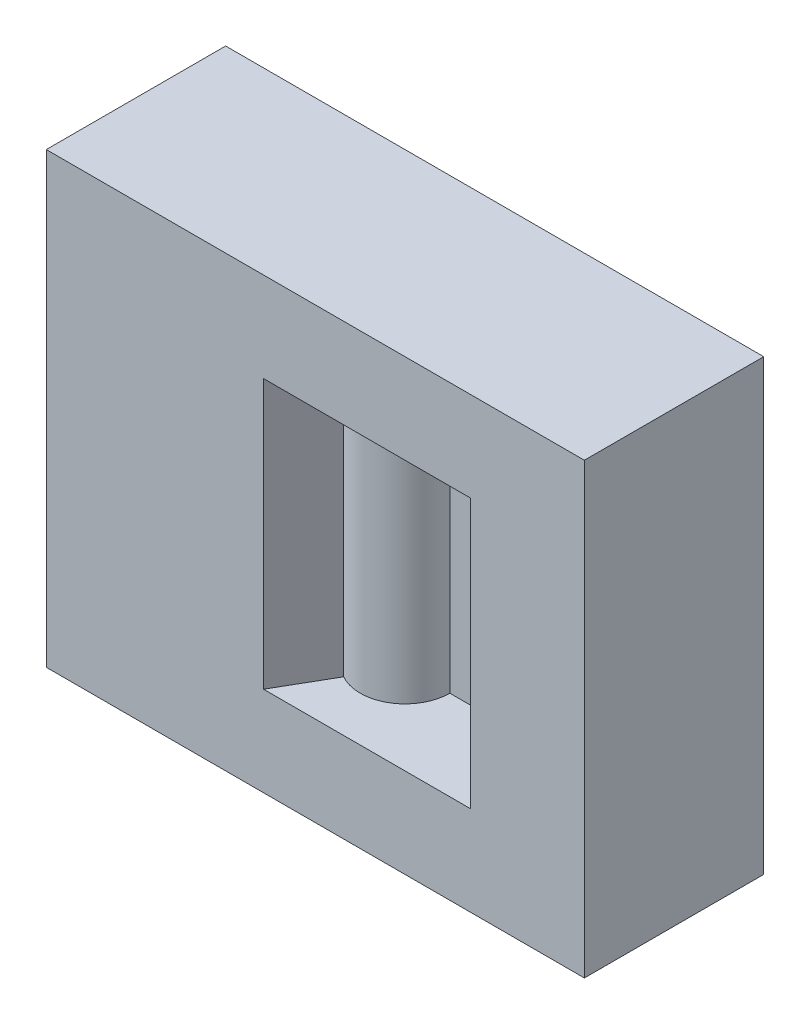
ISO-10303-21;
HEADER;
FILE_DESCRIPTION(('STEP AP214'),'2;1');
FILE_NAME('part.step','',(''),(''),'','','');
FILE_SCHEMA(('AUTOMOTIVE_DESIGN { 1 0 10303 214 1 1 1 1 }'));
ENDSEC;
DATA;
#1=APPLICATION_CONTEXT('core data for automotive mechanical design processes');
#2=APPLICATION_PROTOCOL_DEFINITION('international standard','automotive_design',2000,#1);
#3=PRODUCT_CONTEXT('',#1,'mechanical');
#4=PRODUCT('Part','Part','',(#3));
#5=PRODUCT_RELATED_PRODUCT_CATEGORY('part','',(#4));
#6=PRODUCT_DEFINITION_FORMATION('','',#4);
#7=PRODUCT_DEFINITION_CONTEXT('part definition',#1,'design');
#8=PRODUCT_DEFINITION('design','',#6,#7);
#9=PRODUCT_DEFINITION_SHAPE('','',#8);
#10=(LENGTH_UNIT() NAMED_UNIT(*) SI_UNIT(.MILLI.,.METRE.));
#11=(NAMED_UNIT(*) PLANE_ANGLE_UNIT() SI_UNIT($,.RADIAN.));
#12=(NAMED_UNIT(*) SI_UNIT($,.STERADIAN.) SOLID_ANGLE_UNIT());
#13=UNCERTAINTY_MEASURE_WITH_UNIT(LENGTH_MEASURE(1.E-05),#10,'distance_accuracy_value','');
#14=(GEOMETRIC_REPRESENTATION_CONTEXT(3) GLOBAL_UNCERTAINTY_ASSIGNED_CONTEXT((#13)) GLOBAL_UNIT_ASSIGNED_CONTEXT((#10,
#11,#12)) REPRESENTATION_CONTEXT('',''));
#15=CARTESIAN_POINT('',(0.,0.,0.));
#16=DIRECTION('',(0.,0.,1.));
#17=DIRECTION('',(1.,0.,0.));
#18=AXIS2_PLACEMENT_3D('',#15,#16,#17);
#19=CARTESIAN_POINT('',(0.,0.,10.));
#20=DIRECTION('',(0.,0.,1.));
#21=DIRECTION('',(1.,0.,0.));
#22=AXIS2_PLACEMENT_3D('',#19,#20,#21);
#23=PLANE('',#22);
#24=DIRECTION('',(0.,-1.,0.));
#25=VECTOR('',#24,1.);
#26=CARTESIAN_POINT('',(-30.,40.,10.));
#27=LINE('',#26,#25);
#28=CARTESIAN_POINT('',(-30.,40.,10.));
#29=VERTEX_POINT('',#28);
#30=CARTESIAN_POINT('',(-30.,-10.,10.));
#31=VERTEX_POINT('',#30);
#32=EDGE_CURVE('E161',#29,#31,#27,.T.);
#33=ORIENTED_EDGE('',*,*,#32,.T.);
#34=DIRECTION('',(1.,0.,0.));
#35=VECTOR('',#34,1.);
#36=CARTESIAN_POINT('',(-30.,-10.,10.));
#37=LINE('',#36,#35);
#38=CARTESIAN_POINT('',(30.,-10.,10.));
#39=VERTEX_POINT('',#38);
#40=EDGE_CURVE('E94',#31,#39,#37,.T.);
#41=ORIENTED_EDGE('',*,*,#40,.T.);
#42=DIRECTION('',(0.,1.,0.));
#43=VECTOR('',#42,1.);
#44=CARTESIAN_POINT('',(30.,-10.,10.));
#45=LINE('',#44,#43);
#46=CARTESIAN_POINT('',(30.,40.,10.));
#47=VERTEX_POINT('',#46);
#48=EDGE_CURVE('E164',#39,#47,#45,.T.);
#49=ORIENTED_EDGE('',*,*,#48,.T.);
#50=DIRECTION('',(-1.,0.,0.));
#51=VECTOR('',#50,1.);
#52=CARTESIAN_POINT('',(30.,40.,10.));
#53=LINE('',#52,#51);
#54=EDGE_CURVE('E65',#47,#29,#53,.T.);
#55=ORIENTED_EDGE('',*,*,#54,.T.);
#56=EDGE_LOOP('',(#33,#41,#49,#55));
#57=FACE_BOUND('',#56,.T.);
#58=DIRECTION('',(0.,1.,0.));
#59=VECTOR('',#58,1.);
#60=CARTESIAN_POINT('',(17.3205080756888,0.,10.));
#61=LINE('',#60,#59);
#62=CARTESIAN_POINT('',(17.3205080756888,30.,10.));
#63=VERTEX_POINT('',#62);
#64=CARTESIAN_POINT('',(17.3205080756888,0.,10.));
#65=VERTEX_POINT('',#64);
#66=EDGE_CURVE('E49',#63,#65,#61,.F.);
#67=ORIENTED_EDGE('',*,*,#66,.T.);
#68=DIRECTION('',(-1.,0.,0.));
#69=VECTOR('',#68,1.);
#70=CARTESIAN_POINT('',(0.,0.,10.));
#71=LINE('',#70,#69);
#72=CARTESIAN_POINT('',(-5.77350269189625,0.,10.));
#73=VERTEX_POINT('',#72);
#74=EDGE_CURVE('E11',#65,#73,#71,.T.);
#75=ORIENTED_EDGE('',*,*,#74,.T.);
#76=DIRECTION('',(0.,-1.,0.));
#77=VECTOR('',#76,1.);
#78=CARTESIAN_POINT('',(-5.77350269189625,0.,10.));
#79=LINE('',#78,#77);
#80=CARTESIAN_POINT('',(-5.77350269189625,30.,10.));
#81=VERTEX_POINT('',#80);
#82=EDGE_CURVE('E183',#81,#73,#79,.T.);
#83=ORIENTED_EDGE('',*,*,#82,.F.);
#84=DIRECTION('',(1.,0.,0.));
#85=VECTOR('',#84,1.);
#86=CARTESIAN_POINT('',(0.,30.,10.));
#87=LINE('',#86,#85);
#88=EDGE_CURVE('E185',#81,#63,#87,.T.);
#89=ORIENTED_EDGE('',*,*,#88,.T.);
#90=EDGE_LOOP('',(#67,#75,#83,#89));
#91=FACE_BOUND('',#90,.T.);
#92=ADVANCED_FACE('F41',(#57,#91),#23,.T.);
#93=CARTESIAN_POINT('',(-30.,40.,10.));
#94=DIRECTION('',(1.,0.,0.));
#95=DIRECTION('',(0.,0.,-1.));
#96=AXIS2_PLACEMENT_3D('',#93,#94,#95);
#97=PLANE('',#96);
#98=DIRECTION('',(0.,-1.,0.));
#99=VECTOR('',#98,1.);
#100=CARTESIAN_POINT('',(-30.,40.,-10.));
#101=LINE('',#100,#99);
#102=CARTESIAN_POINT('',(-30.,40.,-10.));
#103=VERTEX_POINT('',#102);
#104=CARTESIAN_POINT('',(-30.,-10.,-10.));
#105=VERTEX_POINT('',#104);
#106=EDGE_CURVE('E133',#103,#105,#101,.T.);
#107=ORIENTED_EDGE('',*,*,#106,.T.);
#108=DIRECTION('',(0.,0.,-1.));
#109=VECTOR('',#108,1.);
#110=CARTESIAN_POINT('',(-30.,-10.,10.));
#111=LINE('',#110,#109);
#112=EDGE_CURVE('E181',#31,#105,#111,.T.);
#113=ORIENTED_EDGE('',*,*,#112,.F.);
#114=ORIENTED_EDGE('',*,*,#32,.F.);
#115=DIRECTION('',(0.,0.,-1.));
#116=VECTOR('',#115,1.);
#117=CARTESIAN_POINT('',(-30.,40.,10.));
#118=LINE('',#117,#116);
#119=EDGE_CURVE('E167',#29,#103,#118,.T.);
#120=ORIENTED_EDGE('',*,*,#119,.T.);
#121=EDGE_LOOP('',(#107,#113,#114,#120));
#122=FACE_BOUND('',#121,.T.);
#123=ADVANCED_FACE('F43',(#122),#97,.F.);
#124=CARTESIAN_POINT('',(-30.,-10.,10.));
#125=DIRECTION('',(0.,1.,0.));
#126=DIRECTION('',(0.,0.,1.));
#127=AXIS2_PLACEMENT_3D('',#124,#125,#126);
#128=PLANE('',#127);
#129=DIRECTION('',(1.,0.,0.));
#130=VECTOR('',#129,1.);
#131=CARTESIAN_POINT('',(-30.,-10.,-10.));
#132=LINE('',#131,#130);
#133=CARTESIAN_POINT('',(30.,-10.,-10.));
#134=VERTEX_POINT('',#133);
#135=EDGE_CURVE('E170',#105,#134,#132,.T.);
#136=ORIENTED_EDGE('',*,*,#135,.T.);
#137=DIRECTION('',(0.,0.,-1.));
#138=VECTOR('',#137,1.);
#139=CARTESIAN_POINT('',(30.,-10.,10.));
#140=LINE('',#139,#138);
#141=EDGE_CURVE('E178',#39,#134,#140,.T.);
#142=ORIENTED_EDGE('',*,*,#141,.F.);
#143=ORIENTED_EDGE('',*,*,#40,.F.);
#144=ORIENTED_EDGE('',*,*,#112,.T.);
#145=EDGE_LOOP('',(#136,#142,#143,#144));
#146=FACE_BOUND('',#145,.T.);
#147=ADVANCED_FACE('F212',(#146),#128,.F.);
#148=CARTESIAN_POINT('',(30.,-10.,10.));
#149=DIRECTION('',(-1.,0.,0.));
#150=DIRECTION('',(0.,0.,1.));
#151=AXIS2_PLACEMENT_3D('',#148,#149,#150);
#152=PLANE('',#151);
#153=DIRECTION('',(0.,1.,0.));
#154=VECTOR('',#153,1.);
#155=CARTESIAN_POINT('',(30.,-10.,-10.));
#156=LINE('',#155,#154);
#157=CARTESIAN_POINT('',(30.,40.,-10.));
#158=VERTEX_POINT('',#157);
#159=EDGE_CURVE('E172',#134,#158,#156,.T.);
#160=ORIENTED_EDGE('',*,*,#159,.T.);
#161=DIRECTION('',(0.,0.,-1.));
#162=VECTOR('',#161,1.);
#163=CARTESIAN_POINT('',(30.,40.,10.));
#164=LINE('',#163,#162);
#165=EDGE_CURVE('E176',#47,#158,#164,.T.);
#166=ORIENTED_EDGE('',*,*,#165,.F.);
#167=ORIENTED_EDGE('',*,*,#48,.F.);
#168=ORIENTED_EDGE('',*,*,#141,.T.);
#169=EDGE_LOOP('',(#160,#166,#167,#168));
#170=FACE_BOUND('',#169,.T.);
#171=ADVANCED_FACE('F223',(#170),#152,.F.);
#172=CARTESIAN_POINT('',(30.,40.,10.));
#173=DIRECTION('',(0.,-1.,0.));
#174=DIRECTION('',(0.,0.,-1.));
#175=AXIS2_PLACEMENT_3D('',#172,#173,#174);
#176=PLANE('',#175);
#177=DIRECTION('',(-1.,0.,0.));
#178=VECTOR('',#177,1.);
#179=CARTESIAN_POINT('',(30.,40.,-10.));
#180=LINE('',#179,#178);
#181=EDGE_CURVE('E86',#158,#103,#180,.T.);
#182=ORIENTED_EDGE('',*,*,#181,.T.);
#183=ORIENTED_EDGE('',*,*,#119,.F.);
#184=ORIENTED_EDGE('',*,*,#54,.F.);
#185=ORIENTED_EDGE('',*,*,#165,.T.);
#186=EDGE_LOOP('',(#182,#183,#184,#185));
#187=FACE_BOUND('',#186,.T.);
#188=ADVANCED_FACE('F219',(#187),#176,.F.);
#189=CARTESIAN_POINT('',(0.,0.,-10.));
#190=DIRECTION('',(0.,0.,1.));
#191=DIRECTION('',(1.,0.,0.));
#192=AXIS2_PLACEMENT_3D('',#189,#190,#191);
#193=PLANE('',#192);
#194=ORIENTED_EDGE('',*,*,#106,.F.);
#195=ORIENTED_EDGE('',*,*,#181,.F.);
#196=ORIENTED_EDGE('',*,*,#159,.F.);
#197=ORIENTED_EDGE('',*,*,#135,.F.);
#198=EDGE_LOOP('',(#194,#195,#196,#197));
#199=FACE_BOUND('',#198,.T.);
#200=ADVANCED_FACE('F217',(#199),#193,.F.);
#201=CARTESIAN_POINT('',(0.,0.,0.));
#202=DIRECTION('',(0.,1.,0.));
#203=DIRECTION('',(0.,0.,1.));
#204=AXIS2_PLACEMENT_3D('',#201,#202,#203);
#205=CYLINDRICAL_SURFACE('',#204,5.);
#206=CARTESIAN_POINT('',(0.,0.,0.));
#207=DIRECTION('',(0.,1.,0.));
#208=DIRECTION('',(0.,0.,1.));
#209=AXIS2_PLACEMENT_3D('',#206,#207,#208);
#210=CIRCLE('',#209,5.);
#211=CARTESIAN_POINT('',(-2.5,0.,4.33012701892219));
#212=VERTEX_POINT('',#211);
#213=CARTESIAN_POINT('',(5.,0.,0.));
#214=VERTEX_POINT('',#213);
#215=EDGE_CURVE('E122',#212,#214,#210,.T.);
#216=ORIENTED_EDGE('',*,*,#215,.T.);
#217=DIRECTION('',(0.,-1.,0.));
#218=VECTOR('',#217,1.);
#219=CARTESIAN_POINT('',(5.,30.,0.));
#220=LINE('',#219,#218);
#221=CARTESIAN_POINT('',(5.,30.,0.));
#222=VERTEX_POINT('',#221);
#223=EDGE_CURVE('E126',#222,#214,#220,.T.);
#224=ORIENTED_EDGE('',*,*,#223,.F.);
#225=CARTESIAN_POINT('',(0.,30.,0.));
#226=DIRECTION('',(0.,1.,0.));
#227=DIRECTION('',(0.,0.,1.));
#228=AXIS2_PLACEMENT_3D('',#225,#226,#227);
#229=CIRCLE('',#228,5.);
#230=CARTESIAN_POINT('',(-2.5,30.,4.33012701892219));
#231=VERTEX_POINT('',#230);
#232=EDGE_CURVE('E156',#231,#222,#229,.T.);
#233=ORIENTED_EDGE('',*,*,#232,.F.);
#234=DIRECTION('',(0.,-1.,0.));
#235=VECTOR('',#234,1.);
#236=CARTESIAN_POINT('',(-2.5,30.,4.33012701892219));
#237=LINE('',#236,#235);
#238=EDGE_CURVE('E128',#231,#212,#237,.T.);
#239=ORIENTED_EDGE('',*,*,#238,.T.);
#240=EDGE_LOOP('',(#216,#224,#233,#239));
#241=FACE_BOUND('',#240,.T.);
#242=ADVANCED_FACE('F124',(#241),#205,.T.);
#243=CARTESIAN_POINT('',(-2.5,0.,4.33012701892219));
#244=DIRECTION('',(0.,1.,0.));
#245=DIRECTION('',(0.,0.,1.));
#246=AXIS2_PLACEMENT_3D('',#243,#244,#245);
#247=PLANE('',#246);
#248=CARTESIAN_POINT('',(0.,0.,0.));
#249=DIRECTION('',(0.,1.,0.));
#250=DIRECTION('',(0.,0.,1.));
#251=AXIS2_PLACEMENT_3D('',#248,#249,#250);
#252=CIRCLE('',#251,20.);
#253=CARTESIAN_POINT('',(20.,0.,0.));
#254=VERTEX_POINT('',#253);
#255=EDGE_CURVE('E134',#65,#254,#252,.T.);
#256=ORIENTED_EDGE('',*,*,#255,.T.);
#257=DIRECTION('',(1.,0.,0.));
#258=VECTOR('',#257,1.);
#259=CARTESIAN_POINT('',(5.,0.,0.));
#260=LINE('',#259,#258);
#261=EDGE_CURVE('E140',#214,#254,#260,.T.);
#262=ORIENTED_EDGE('',*,*,#261,.F.);
#263=ORIENTED_EDGE('',*,*,#215,.F.);
#264=DIRECTION('',(-0.5,0.,0.866025403784439));
#265=VECTOR('',#264,1.);
#266=CARTESIAN_POINT('',(-2.5,0.,4.33012701892219));
#267=LINE('',#266,#265);
#268=EDGE_CURVE('E153',#212,#73,#267,.T.);
#269=ORIENTED_EDGE('',*,*,#268,.T.);
#270=ORIENTED_EDGE('',*,*,#74,.F.);
#271=EDGE_LOOP('',(#256,#262,#263,#269,#270));
#272=FACE_BOUND('',#271,.T.);
#273=ADVANCED_FACE('F145',(#272),#247,.T.);
#274=CARTESIAN_POINT('',(0.,0.,0.));
#275=DIRECTION('',(0.,1.,0.));
#276=DIRECTION('',(0.,0.,1.));
#277=AXIS2_PLACEMENT_3D('',#274,#275,#276);
#278=CYLINDRICAL_SURFACE('',#277,20.);
#279=CARTESIAN_POINT('',(0.,30.,0.));
#280=DIRECTION('',(0.,1.,0.));
#281=DIRECTION('',(0.,0.,1.));
#282=AXIS2_PLACEMENT_3D('',#279,#280,#281);
#283=CIRCLE('',#282,20.);
#284=CARTESIAN_POINT('',(20.,30.,0.));
#285=VERTEX_POINT('',#284);
#286=EDGE_CURVE('E158',#63,#285,#283,.T.);
#287=ORIENTED_EDGE('',*,*,#286,.T.);
#288=DIRECTION('',(0.,1.,0.));
#289=VECTOR('',#288,1.);
#290=CARTESIAN_POINT('',(20.,0.,0.));
#291=LINE('',#290,#289);
#292=EDGE_CURVE('E147',#254,#285,#291,.T.);
#293=ORIENTED_EDGE('',*,*,#292,.F.);
#294=ORIENTED_EDGE('',*,*,#255,.F.);
#295=ORIENTED_EDGE('',*,*,#66,.F.);
#296=EDGE_LOOP('',(#287,#293,#294,#295));
#297=FACE_BOUND('',#296,.T.);
#298=ADVANCED_FACE('F192',(#297),#278,.F.);
#299=CARTESIAN_POINT('',(-9.99999999999999,30.,17.3205080756888));
#300=DIRECTION('',(0.,-1.,0.));
#301=DIRECTION('',(0.,0.,-1.));
#302=AXIS2_PLACEMENT_3D('',#299,#300,#301);
#303=PLANE('',#302);
#304=DIRECTION('',(0.5,0.,-0.866025403784439));
#305=VECTOR('',#304,1.);
#306=CARTESIAN_POINT('',(-9.99999999999999,30.,17.3205080756888));
#307=LINE('',#306,#305);
#308=EDGE_CURVE('E56',#81,#231,#307,.T.);
#309=ORIENTED_EDGE('',*,*,#308,.T.);
#310=ORIENTED_EDGE('',*,*,#232,.T.);
#311=DIRECTION('',(-1.,0.,0.));
#312=VECTOR('',#311,1.);
#313=CARTESIAN_POINT('',(20.,30.,0.));
#314=LINE('',#313,#312);
#315=EDGE_CURVE('E143',#285,#222,#314,.T.);
#316=ORIENTED_EDGE('',*,*,#315,.F.);
#317=ORIENTED_EDGE('',*,*,#286,.F.);
#318=ORIENTED_EDGE('',*,*,#88,.F.);
#319=EDGE_LOOP('',(#309,#310,#316,#317,#318));
#320=FACE_BOUND('',#319,.T.);
#321=ADVANCED_FACE('F194',(#320),#303,.T.);
#322=CARTESIAN_POINT('',(0.,0.,0.));
#323=DIRECTION('',(-0.866025403784439,0.,-0.5));
#324=DIRECTION('',(-0.5,0.,0.866025403784439));
#325=AXIS2_PLACEMENT_3D('',#322,#323,#324);
#326=PLANE('',#325);
#327=ORIENTED_EDGE('',*,*,#82,.T.);
#328=ORIENTED_EDGE('',*,*,#268,.F.);
#329=ORIENTED_EDGE('',*,*,#238,.F.);
#330=ORIENTED_EDGE('',*,*,#308,.F.);
#331=EDGE_LOOP('',(#327,#328,#329,#330));
#332=FACE_BOUND('',#331,.T.);
#333=ADVANCED_FACE('F195',(#332),#326,.F.);
#334=CARTESIAN_POINT('',(0.,0.,0.));
#335=DIRECTION('',(0.,0.,1.));
#336=DIRECTION('',(1.,0.,0.));
#337=AXIS2_PLACEMENT_3D('',#334,#335,#336);
#338=PLANE('',#337);
#339=ORIENTED_EDGE('',*,*,#223,.T.);
#340=ORIENTED_EDGE('',*,*,#261,.T.);
#341=ORIENTED_EDGE('',*,*,#292,.T.);
#342=ORIENTED_EDGE('',*,*,#315,.T.);
#343=EDGE_LOOP('',(#339,#340,#341,#342));
#344=FACE_BOUND('',#343,.T.);
#345=ADVANCED_FACE('F138',(#344),#338,.T.);
#346=CLOSED_SHELL('',(#92,#123,#147,#171,#188,#200,#242,#273,#298,#321,#333,#345));
#347=MANIFOLD_SOLID_BREP('B2',#346);
#348=ADVANCED_BREP_SHAPE_REPRESENTATION('',(#18,#347),#14);
#349=SHAPE_DEFINITION_REPRESENTATION(#9,#348);
ENDSEC;
END-ISO-10303-21;
